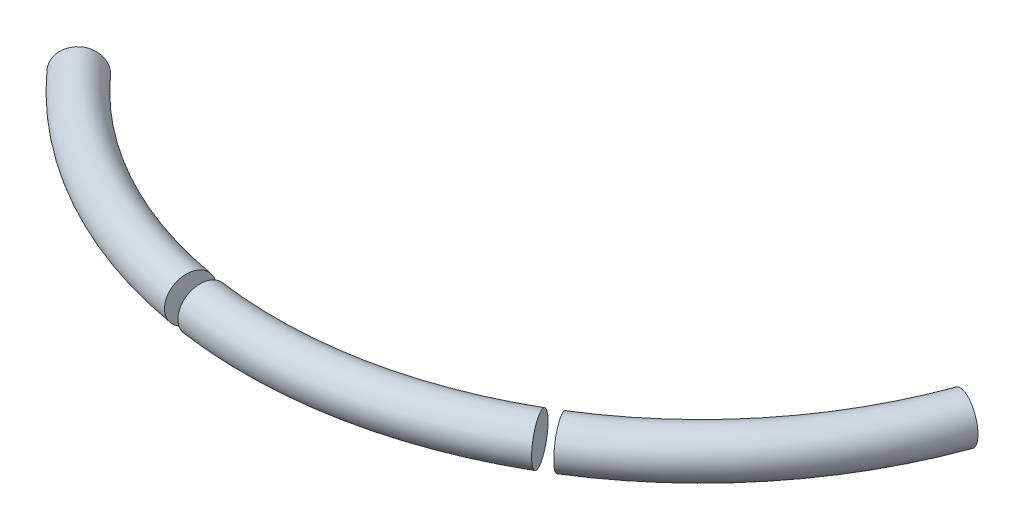
ISO-10303-21;
HEADER;
FILE_DESCRIPTION(('STEP AP214'),'2;1');
FILE_NAME('part.step','',(''),(''),'','','');
FILE_SCHEMA(('AUTOMOTIVE_DESIGN { 1 0 10303 214 1 1 1 1 }'));
ENDSEC;
DATA;
#1=APPLICATION_CONTEXT('core data for automotive mechanical design processes');
#2=APPLICATION_PROTOCOL_DEFINITION('international standard','automotive_design',2000,#1);
#3=PRODUCT_CONTEXT('',#1,'mechanical');
#4=PRODUCT('Part','Part','',(#3));
#5=PRODUCT_RELATED_PRODUCT_CATEGORY('part','',(#4));
#6=PRODUCT_DEFINITION_FORMATION('','',#4);
#7=PRODUCT_DEFINITION_CONTEXT('part definition',#1,'design');
#8=PRODUCT_DEFINITION('design','',#6,#7);
#9=PRODUCT_DEFINITION_SHAPE('','',#8);
#10=(LENGTH_UNIT() NAMED_UNIT(*) SI_UNIT(.MILLI.,.METRE.));
#11=(NAMED_UNIT(*) PLANE_ANGLE_UNIT() SI_UNIT($,.RADIAN.));
#12=(NAMED_UNIT(*) SI_UNIT($,.STERADIAN.) SOLID_ANGLE_UNIT());
#13=UNCERTAINTY_MEASURE_WITH_UNIT(LENGTH_MEASURE(1.E-05),#10,'distance_accuracy_value','');
#14=(GEOMETRIC_REPRESENTATION_CONTEXT(3) GLOBAL_UNCERTAINTY_ASSIGNED_CONTEXT((#13)) GLOBAL_UNIT_ASSIGNED_CONTEXT((#10,
#11,#12)) REPRESENTATION_CONTEXT('',''));
#15=CARTESIAN_POINT('',(0.,0.,0.));
#16=DIRECTION('',(0.,0.,1.));
#17=DIRECTION('',(1.,0.,0.));
#18=AXIS2_PLACEMENT_3D('',#15,#16,#17);
#19=CARTESIAN_POINT('',(0.,5.,0.));
#20=DIRECTION('',(0.984807753012209,0.,0.173648177666928));
#21=DIRECTION('',(0.173648177666928,0.,-0.984807753012209));
#22=AXIS2_PLACEMENT_3D('',#19,#20,#21);
#23=PLANE('',#22);
#24=CARTESIAN_POINT('',(-1.35879699024371,0.7302,7.70612066732053));
#25=DIRECTION('',(-0.984807753012209,0.,-0.173648177666928));
#26=DIRECTION('',(0.173648177666928,0.,-0.984807753012209));
#27=AXIS2_PLACEMENT_3D('',#24,#25,#26);
#28=CIRCLE('',#27,0.4);
#29=CARTESIAN_POINT('',(-1.42825626131048,0.7302,8.10004376852542));
#30=VERTEX_POINT('',#29);
#31=EDGE_CURVE('P0_E18',#30,#30,#28,.T.);
#32=ORIENTED_EDGE('',*,*,#31,.F.);
#33=EDGE_LOOP('',(#32));
#34=FACE_BOUND('',#33,.T.);
#35=ADVANCED_FACE('P0_F15',(#34),#23,.T.);
#36=CARTESIAN_POINT('',(0.,5.,0.));
#37=DIRECTION('',(0.66913060635886,0.,0.743144825477393));
#38=DIRECTION('',(0.743144825477393,0.,-0.66913060635886));
#39=AXIS2_PLACEMENT_3D('',#36,#37,#38);
#40=PLANE('',#39);
#41=CARTESIAN_POINT('',(-5.8151082593606,0.7302,5.23594699475807));
#42=DIRECTION('',(-0.66913060635886,0.,-0.743144825477393));
#43=DIRECTION('',(0.743144825477393,0.,-0.66913060635886));
#44=AXIS2_PLACEMENT_3D('',#41,#42,#43);
#45=CIRCLE('',#44,0.4);
#46=CARTESIAN_POINT('',(-6.11236618955156,0.7302,5.50359923730162));
#47=VERTEX_POINT('',#46);
#48=EDGE_CURVE('P0_E10',#47,#47,#45,.T.);
#49=ORIENTED_EDGE('',*,*,#48,.T.);
#50=EDGE_LOOP('',(#49));
#51=FACE_BOUND('',#50,.T.);
#52=ADVANCED_FACE('P0_F36',(#51),#40,.F.);
#53=CARTESIAN_POINT('',(0.,0.7302,0.));
#54=DIRECTION('',(0.,-1.,0.));
#55=DIRECTION('',(0.984807753012209,0.,0.173648177666928));
#56=AXIS2_PLACEMENT_3D('',#53,#54,#55);
#57=TOROIDAL_SURFACE('',#56,7.825,0.4);
#58=CARTESIAN_POINT('',(0.,0.7302,0.));
#59=DIRECTION('',(0.,-1.,0.));
#60=DIRECTION('',(0.984807753012209,0.,0.173648177666928));
#61=AXIS2_PLACEMENT_3D('',#58,#59,#60);
#62=CIRCLE('',#61,8.225);
#63=EDGE_CURVE('',#30,#47,#62,.T.);
#64=ORIENTED_EDGE('',*,*,#31,.T.);
#65=ORIENTED_EDGE('',*,*,#48,.F.);
#66=ORIENTED_EDGE('',*,*,#63,.T.);
#67=ORIENTED_EDGE('',*,*,#63,.F.);
#68=EDGE_LOOP('',(#64,#66,#65,#67));
#69=FACE_BOUND('',#68,.T.);
#70=ADVANCED_FACE('P0_F33',(#69),#57,.T.);
#71=CLOSED_SHELL('',(#35,#52,#70));
#72=MANIFOLD_SOLID_BREP('P0_B1',#71);
#73=CARTESIAN_POINT('',(0.,5.,0.));
#74=DIRECTION('',(0.342020143325663,0.,-0.939692620785911));
#75=DIRECTION('',(-0.939692620785911,0.,-0.342020143325663));
#76=AXIS2_PLACEMENT_3D('',#73,#74,#75);
#77=PLANE('',#76);
#78=CARTESIAN_POINT('',(7.35309475764975,0.7302,2.67630762152331));
#79=DIRECTION('',(-0.342020143325663,0.,0.939692620785911));
#80=DIRECTION('',(-0.939692620785911,0.,-0.342020143325663));
#81=AXIS2_PLACEMENT_3D('',#78,#79,#80);
#82=CIRCLE('',#81,0.4);
#83=CARTESIAN_POINT('',(7.72897180596411,0.7302,2.81311567885358));
#84=VERTEX_POINT('',#83);
#85=EDGE_CURVE('P1_E18',#84,#84,#82,.T.);
#86=ORIENTED_EDGE('',*,*,#85,.F.);
#87=EDGE_LOOP('',(#86));
#88=FACE_BOUND('',#87,.T.);
#89=ADVANCED_FACE('P1_F15',(#88),#77,.T.);
#90=CARTESIAN_POINT('',(0.,5.,0.));
#91=DIRECTION('',(0.848048096156424,0.,-0.529919264233209));
#92=DIRECTION('',(-0.529919264233209,0.,-0.848048096156424));
#93=AXIS2_PLACEMENT_3D('',#90,#91,#92);
#94=PLANE('',#93);
#95=CARTESIAN_POINT('',(4.14661824262486,0.7302,6.63597635242401));
#96=DIRECTION('',(-0.848048096156424,0.,0.529919264233209));
#97=DIRECTION('',(-0.52991926423321,0.,-0.848048096156423));
#98=AXIS2_PLACEMENT_3D('',#95,#96,#97);
#99=CIRCLE('',#98,0.4);
#100=CARTESIAN_POINT('',(4.35858594831815,0.7302,6.97519559088658));
#101=VERTEX_POINT('',#100);
#102=EDGE_CURVE('P1_E10',#101,#101,#99,.T.);
#103=ORIENTED_EDGE('',*,*,#102,.T.);
#104=EDGE_LOOP('',(#103));
#105=FACE_BOUND('',#104,.T.);
#106=ADVANCED_FACE('P1_F36',(#105),#94,.F.);
#107=CARTESIAN_POINT('',(0.,0.7302,0.));
#108=DIRECTION('',(0.,-1.,0.));
#109=DIRECTION('',(0.342020143325663,0.,-0.939692620785911));
#110=AXIS2_PLACEMENT_3D('',#107,#108,#109);
#111=TOROIDAL_SURFACE('',#110,7.825,0.4);
#112=CARTESIAN_POINT('',(0.,0.7302,0.));
#113=DIRECTION('',(0.,-1.,0.));
#114=DIRECTION('',(0.342020143325663,0.,-0.939692620785911));
#115=AXIS2_PLACEMENT_3D('',#112,#113,#114);
#116=CIRCLE('',#115,8.225);
#117=EDGE_CURVE('',#84,#101,#116,.T.);
#118=ORIENTED_EDGE('',*,*,#85,.T.);
#119=ORIENTED_EDGE('',*,*,#102,.F.);
#120=ORIENTED_EDGE('',*,*,#117,.T.);
#121=ORIENTED_EDGE('',*,*,#117,.F.);
#122=EDGE_LOOP('',(#118,#120,#119,#121));
#123=FACE_BOUND('',#122,.T.);
#124=ADVANCED_FACE('P1_F33',(#123),#111,.T.);
#125=CLOSED_SHELL('',(#89,#106,#124));
#126=MANIFOLD_SOLID_BREP('P1_B1',#125);
#127=CARTESIAN_POINT('',(0.,5.,0.));
#128=DIRECTION('',(0.866025403784436,0.,-0.5));
#129=DIRECTION('',(-0.5,0.,-0.866025403784436));
#130=AXIS2_PLACEMENT_3D('',#127,#128,#129);
#131=PLANE('',#130);
#132=CARTESIAN_POINT('',(3.9125,0.7302,6.77664878461321));
#133=DIRECTION('',(-0.866025403784436,0.,0.5));
#134=DIRECTION('',(-0.5,0.,-0.866025403784436));
#135=AXIS2_PLACEMENT_3D('',#132,#133,#134);
#136=CIRCLE('',#135,0.4);
#137=CARTESIAN_POINT('',(4.11250000000001,0.7302,7.123058946127));
#138=VERTEX_POINT('',#137);
#139=EDGE_CURVE('P2_E18',#138,#138,#136,.T.);
#140=ORIENTED_EDGE('',*,*,#139,.F.);
#141=EDGE_LOOP('',(#140));
#142=FACE_BOUND('',#141,.T.);
#143=ADVANCED_FACE('P2_F15',(#142),#131,.T.);
#144=CARTESIAN_POINT('',(0.,5.,0.));
#145=DIRECTION('',(0.990268068741571,0.,0.139173100960062));
#146=DIRECTION('',(0.139173100960062,0.,-0.990268068741571));
#147=AXIS2_PLACEMENT_3D('',#144,#145,#146);
#148=PLANE('',#147);
#149=CARTESIAN_POINT('',(-1.08902951501249,0.7302,7.74884763790279));
#150=DIRECTION('',(-0.990268068741571,0.,-0.139173100960062));
#151=DIRECTION('',(0.139173100960062,0.,-0.990268068741571));
#152=AXIS2_PLACEMENT_3D('',#149,#150,#151);
#153=CIRCLE('',#152,0.4);
#154=CARTESIAN_POINT('',(-1.14469875539651,0.7302,8.14495486539942));
#155=VERTEX_POINT('',#154);
#156=EDGE_CURVE('P2_E10',#155,#155,#153,.T.);
#157=ORIENTED_EDGE('',*,*,#156,.T.);
#158=EDGE_LOOP('',(#157));
#159=FACE_BOUND('',#158,.T.);
#160=ADVANCED_FACE('P2_F36',(#159),#148,.F.);
#161=CARTESIAN_POINT('',(0.,0.7302,0.));
#162=DIRECTION('',(0.,-1.,0.));
#163=DIRECTION('',(0.866025403784436,0.,-0.5));
#164=AXIS2_PLACEMENT_3D('',#161,#162,#163);
#165=TOROIDAL_SURFACE('',#164,7.825,0.4);
#166=CARTESIAN_POINT('',(0.,0.7302,0.));
#167=DIRECTION('',(0.,-1.,0.));
#168=DIRECTION('',(0.866025403784436,0.,-0.5));
#169=AXIS2_PLACEMENT_3D('',#166,#167,#168);
#170=CIRCLE('',#169,8.225);
#171=EDGE_CURVE('',#138,#155,#170,.T.);
#172=ORIENTED_EDGE('',*,*,#139,.T.);
#173=ORIENTED_EDGE('',*,*,#156,.F.);
#174=ORIENTED_EDGE('',*,*,#171,.T.);
#175=ORIENTED_EDGE('',*,*,#171,.F.);
#176=EDGE_LOOP('',(#172,#174,#173,#175));
#177=FACE_BOUND('',#176,.T.);
#178=ADVANCED_FACE('P2_F33',(#177),#165,.T.);
#179=CLOSED_SHELL('',(#143,#160,#178));
#180=MANIFOLD_SOLID_BREP('P2_B1',#179);
#181=ADVANCED_BREP_SHAPE_REPRESENTATION('',(#18,#72,#126,#180),#14);
#182=SHAPE_DEFINITION_REPRESENTATION(#9,#181);
ENDSEC;
END-ISO-10303-21;
